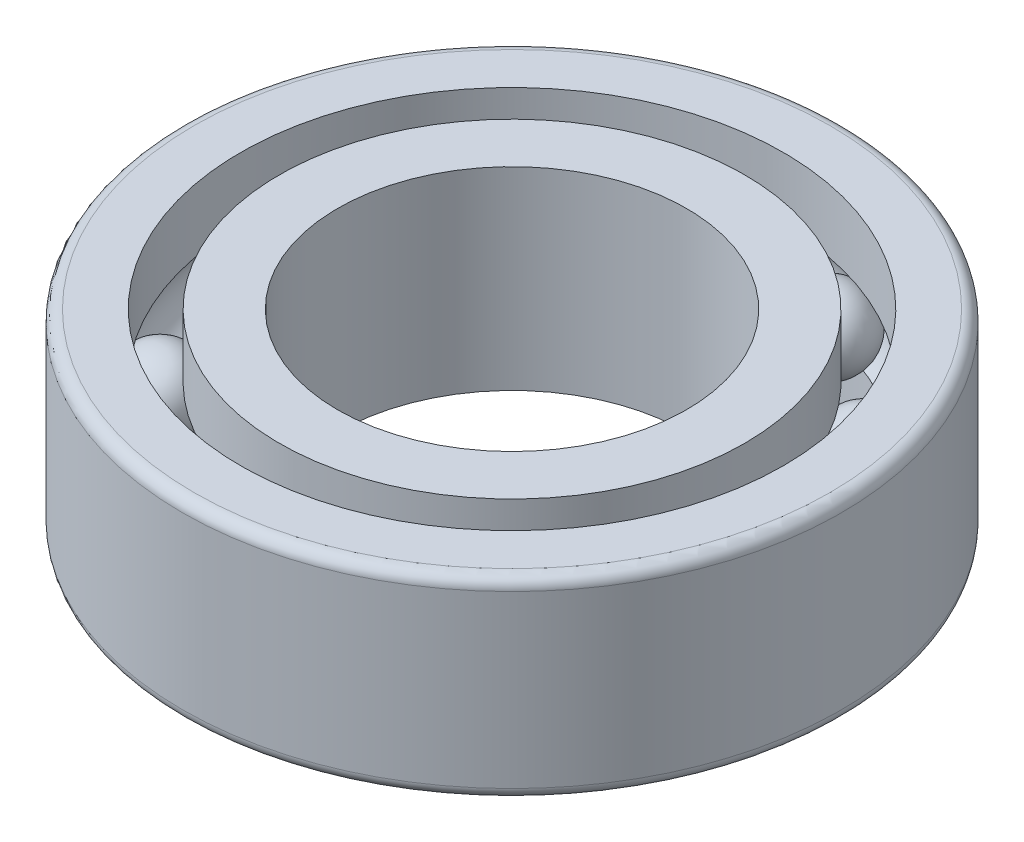
ISO-10303-21;
HEADER;
FILE_DESCRIPTION(('STEP AP214'),'2;1');
FILE_NAME('part.step','',(''),(''),'','','');
FILE_SCHEMA(('AUTOMOTIVE_DESIGN { 1 0 10303 214 1 1 1 1 }'));
ENDSEC;
DATA;
#1=APPLICATION_CONTEXT('core data for automotive mechanical design processes');
#2=APPLICATION_PROTOCOL_DEFINITION('international standard','automotive_design',2000,#1);
#3=PRODUCT_CONTEXT('',#1,'mechanical');
#4=PRODUCT('Part','Part','',(#3));
#5=PRODUCT_RELATED_PRODUCT_CATEGORY('part','',(#4));
#6=PRODUCT_DEFINITION_FORMATION('','',#4);
#7=PRODUCT_DEFINITION_CONTEXT('part definition',#1,'design');
#8=PRODUCT_DEFINITION('design','',#6,#7);
#9=PRODUCT_DEFINITION_SHAPE('','',#8);
#10=(LENGTH_UNIT() NAMED_UNIT(*) SI_UNIT(.MILLI.,.METRE.));
#11=(NAMED_UNIT(*) PLANE_ANGLE_UNIT() SI_UNIT($,.RADIAN.));
#12=(NAMED_UNIT(*) SI_UNIT($,.STERADIAN.) SOLID_ANGLE_UNIT());
#13=UNCERTAINTY_MEASURE_WITH_UNIT(LENGTH_MEASURE(1.E-05),#10,'distance_accuracy_value','');
#14=(GEOMETRIC_REPRESENTATION_CONTEXT(3) GLOBAL_UNCERTAINTY_ASSIGNED_CONTEXT((#13)) GLOBAL_UNIT_ASSIGNED_CONTEXT((#10,
#11,#12)) REPRESENTATION_CONTEXT('',''));
#15=CARTESIAN_POINT('',(0.,0.,0.));
#16=DIRECTION('',(0.,0.,1.));
#17=DIRECTION('',(1.,0.,0.));
#18=AXIS2_PLACEMENT_3D('',#15,#16,#17);
#19=CARTESIAN_POINT('',(-5.25861046343721,0.,3.82060413990101));
#20=DIRECTION('',(0.,-1.,0.));
#21=DIRECTION('',(-0.809016994374955,0.,0.587785252292462));
#22=AXIS2_PLACEMENT_3D('',#19,#20,#21);
#23=SPHERICAL_SURFACE('',#22,1.00000000000002);
#24=CARTESIAN_POINT('',(-5.25861046343721,-1.00000000000005,3.82060413990101));
#25=VERTEX_POINT('',#24);
#26=VERTEX_LOOP('',#25);
#27=FACE_BOUND('',#26,.T.);
#28=ADVANCED_FACE('F37',(#27),#23,.T.);
#29=CLOSED_SHELL('',(#28));
#30=MANIFOLD_SOLID_BREP('B2',#29);
#31=CARTESIAN_POINT('',(-2.00861046343723,0.,6.18186735591848));
#32=DIRECTION('',(0.,-1.,0.));
#33=DIRECTION('',(-0.309016994374958,0.,0.95105651629515));
#34=AXIS2_PLACEMENT_3D('',#31,#32,#33);
#35=SPHERICAL_SURFACE('',#34,1.00000000000002);
#36=CARTESIAN_POINT('',(-2.00861046343723,-1.00000000000005,6.18186735591848));
#37=VERTEX_POINT('',#36);
#38=VERTEX_LOOP('',#37);
#39=FACE_BOUND('',#38,.T.);
#40=ADVANCED_FACE('F68',(#39),#35,.T.);
#41=CLOSED_SHELL('',(#40));
#42=MANIFOLD_SOLID_BREP('B6',#41);
#43=CARTESIAN_POINT('',(2.0086104634371,0.,6.18186735591852));
#44=DIRECTION('',(0.,-1.,0.));
#45=DIRECTION('',(0.309016994374938,0.,0.951056516295157));
#46=AXIS2_PLACEMENT_3D('',#43,#44,#45);
#47=SPHERICAL_SURFACE('',#46,1.00000000000002);
#48=CARTESIAN_POINT('',(2.0086104634371,-1.00000000000005,6.18186735591852));
#49=VERTEX_POINT('',#48);
#50=VERTEX_LOOP('',#49);
#51=FACE_BOUND('',#50,.T.);
#52=ADVANCED_FACE('F99',(#51),#47,.T.);
#53=CLOSED_SHELL('',(#52));
#54=MANIFOLD_SOLID_BREP('B33',#53);
#55=CARTESIAN_POINT('',(5.25861046343713,0.,3.82060413990112));
#56=DIRECTION('',(0.,-1.,0.));
#57=DIRECTION('',(0.809016994374942,0.,0.58778525229248));
#58=AXIS2_PLACEMENT_3D('',#55,#56,#57);
#59=SPHERICAL_SURFACE('',#58,1.00000000000002);
#60=CARTESIAN_POINT('',(5.25861046343713,-1.00000000000005,3.82060413990112));
#61=VERTEX_POINT('',#60);
#62=VERTEX_LOOP('',#61);
#63=FACE_BOUND('',#62,.T.);
#64=ADVANCED_FACE('F130',(#63),#59,.T.);
#65=CLOSED_SHELL('',(#64));
#66=MANIFOLD_SOLID_BREP('B64',#65);
#67=CARTESIAN_POINT('',(6.5,0.,0.));
#68=DIRECTION('',(0.,-1.,0.));
#69=DIRECTION('',(1.,0.,0.));
#70=AXIS2_PLACEMENT_3D('',#67,#68,#69);
#71=SPHERICAL_SURFACE('',#70,1.00000000000002);
#72=CARTESIAN_POINT('',(6.5,-1.00000000000005,0.));
#73=VERTEX_POINT('',#72);
#74=VERTEX_LOOP('',#73);
#75=FACE_BOUND('',#74,.T.);
#76=ADVANCED_FACE('F161',(#75),#71,.T.);
#77=CLOSED_SHELL('',(#76));
#78=MANIFOLD_SOLID_BREP('B95',#77);
#79=CARTESIAN_POINT('',(5.25861046343718,0.,-3.82060413990105));
#80=DIRECTION('',(0.,-1.,0.));
#81=DIRECTION('',(0.809016994374951,0.,-0.587785252292469));
#82=AXIS2_PLACEMENT_3D('',#79,#80,#81);
#83=SPHERICAL_SURFACE('',#82,1.00000000000002);
#84=CARTESIAN_POINT('',(5.25861046343718,-1.00000000000005,-3.82060413990105));
#85=VERTEX_POINT('',#84);
#86=VERTEX_LOOP('',#85);
#87=FACE_BOUND('',#86,.T.);
#88=ADVANCED_FACE('F192',(#87),#83,.T.);
#89=CLOSED_SHELL('',(#88));
#90=MANIFOLD_SOLID_BREP('B126',#89);
#91=CARTESIAN_POINT('',(2.00861046343719,0.,-6.18186735591849));
#92=DIRECTION('',(0.,-1.,0.));
#93=DIRECTION('',(0.309016994374952,0.,-0.951056516295152));
#94=AXIS2_PLACEMENT_3D('',#91,#92,#93);
#95=SPHERICAL_SURFACE('',#94,1.00000000000002);
#96=CARTESIAN_POINT('',(2.00861046343719,-1.00000000000005,-6.18186735591849));
#97=VERTEX_POINT('',#96);
#98=VERTEX_LOOP('',#97);
#99=FACE_BOUND('',#98,.T.);
#100=ADVANCED_FACE('F223',(#99),#95,.T.);
#101=CLOSED_SHELL('',(#100));
#102=MANIFOLD_SOLID_BREP('B157',#101);
#103=CARTESIAN_POINT('',(-2.00861046343714,0.,-6.18186735591851));
#104=DIRECTION('',(0.,-1.,0.));
#105=DIRECTION('',(-0.309016994374945,0.,-0.951056516295155));
#106=AXIS2_PLACEMENT_3D('',#103,#104,#105);
#107=SPHERICAL_SURFACE('',#106,1.00000000000002);
#108=CARTESIAN_POINT('',(-2.00861046343714,-1.00000000000005,-6.18186735591851));
#109=VERTEX_POINT('',#108);
#110=VERTEX_LOOP('',#109);
#111=FACE_BOUND('',#110,.T.);
#112=ADVANCED_FACE('F254',(#111),#107,.T.);
#113=CLOSED_SHELL('',(#112));
#114=MANIFOLD_SOLID_BREP('B188',#113);
#115=CARTESIAN_POINT('',(-5.25861046343715,0.,-3.82060413990108));
#116=DIRECTION('',(0.,-1.,0.));
#117=DIRECTION('',(-0.809016994374947,0.,-0.587785252292474));
#118=AXIS2_PLACEMENT_3D('',#115,#116,#117);
#119=SPHERICAL_SURFACE('',#118,1.00000000000002);
#120=CARTESIAN_POINT('',(-5.25861046343715,-1.00000000000005,-3.82060413990108));
#121=VERTEX_POINT('',#120);
#122=VERTEX_LOOP('',#121);
#123=FACE_BOUND('',#122,.T.);
#124=ADVANCED_FACE('F285',(#123),#119,.T.);
#125=CLOSED_SHELL('',(#124));
#126=MANIFOLD_SOLID_BREP('B219',#125);
#127=CARTESIAN_POINT('',(-6.5,0.,0.));
#128=DIRECTION('',(0.,-1.,0.));
#129=DIRECTION('',(-1.,0.,0.));
#130=AXIS2_PLACEMENT_3D('',#127,#128,#129);
#131=SPHERICAL_SURFACE('',#130,1.00000000000002);
#132=CARTESIAN_POINT('',(-6.5,-1.00000000000005,0.));
#133=VERTEX_POINT('',#132);
#134=VERTEX_LOOP('',#133);
#135=FACE_BOUND('',#134,.T.);
#136=ADVANCED_FACE('F318',(#135),#131,.T.);
#137=CLOSED_SHELL('',(#136));
#138=MANIFOLD_SOLID_BREP('B250',#137);
#139=CARTESIAN_POINT('',(0.,2.5,0.));
#140=DIRECTION('',(0.,1.,0.));
#141=DIRECTION('',(0.,0.,1.));
#142=AXIS2_PLACEMENT_3D('',#139,#140,#141);
#143=PLANE('',#142);
#144=CARTESIAN_POINT('',(0.,2.49999999999995,0.));
#145=DIRECTION('',(0.,-1.,0.));
#146=DIRECTION('',(1.,0.,0.));
#147=AXIS2_PLACEMENT_3D('',#144,#145,#146);
#148=CIRCLE('',#147,6.99999999999999);
#149=CARTESIAN_POINT('',(6.99999999999998,2.49999999999997,0.));
#150=VERTEX_POINT('',#149);
#151=EDGE_CURVE('E343',#150,#150,#148,.T.);
#152=ORIENTED_EDGE('',*,*,#151,.T.);
#153=EDGE_LOOP('',(#152));
#154=FACE_BOUND('',#153,.T.);
#155=CARTESIAN_POINT('',(0.,2.5,0.));
#156=DIRECTION('',(0.,1.,0.));
#157=DIRECTION('',(0.,0.,1.));
#158=AXIS2_PLACEMENT_3D('',#155,#156,#157);
#159=CIRCLE('',#158,8.2);
#160=CARTESIAN_POINT('',(0.,2.5,8.2));
#161=VERTEX_POINT('',#160);
#162=EDGE_CURVE('E365',#161,#161,#159,.T.);
#163=ORIENTED_EDGE('',*,*,#162,.T.);
#164=EDGE_LOOP('',(#163));
#165=FACE_BOUND('',#164,.T.);
#166=ADVANCED_FACE('F339',(#154,#165),#143,.T.);
#167=CARTESIAN_POINT('',(0.,-2.5,0.));
#168=DIRECTION('',(0.,1.,0.));
#169=DIRECTION('',(0.,0.,1.));
#170=AXIS2_PLACEMENT_3D('',#167,#168,#169);
#171=PLANE('',#170);
#172=CARTESIAN_POINT('',(0.,-2.49999999999995,0.));
#173=DIRECTION('',(0.,-1.,0.));
#174=DIRECTION('',(1.,0.,0.));
#175=AXIS2_PLACEMENT_3D('',#172,#173,#174);
#176=CIRCLE('',#175,7.00000000000001);
#177=CARTESIAN_POINT('',(7.00000000000002,-2.49999999999992,0.));
#178=VERTEX_POINT('',#177);
#179=EDGE_CURVE('E317',#178,#178,#176,.T.);
#180=ORIENTED_EDGE('',*,*,#179,.F.);
#181=EDGE_LOOP('',(#180));
#182=FACE_BOUND('',#181,.T.);
#183=CARTESIAN_POINT('',(0.,-2.5,0.));
#184=DIRECTION('',(0.,1.,0.));
#185=DIRECTION('',(0.,0.,1.));
#186=AXIS2_PLACEMENT_3D('',#183,#184,#185);
#187=CIRCLE('',#186,8.2);
#188=CARTESIAN_POINT('',(0.,-2.5,8.2));
#189=VERTEX_POINT('',#188);
#190=EDGE_CURVE('E362',#189,#189,#187,.F.);
#191=ORIENTED_EDGE('',*,*,#190,.T.);
#192=EDGE_LOOP('',(#191));
#193=FACE_BOUND('',#192,.T.);
#194=ADVANCED_FACE('F388',(#182,#193),#171,.F.);
#195=CARTESIAN_POINT('',(0.,2.5,0.));
#196=DIRECTION('',(0.,-1.,0.));
#197=DIRECTION('',(0.,0.,-1.));
#198=AXIS2_PLACEMENT_3D('',#195,#196,#197);
#199=CYLINDRICAL_SURFACE('',#198,8.5);
#200=CARTESIAN_POINT('',(0.,-2.2,0.));
#201=DIRECTION('',(0.,1.,0.));
#202=DIRECTION('',(0.,0.,1.));
#203=AXIS2_PLACEMENT_3D('',#200,#201,#202);
#204=CIRCLE('',#203,8.5);
#205=CARTESIAN_POINT('',(0.,-2.2,8.5));
#206=VERTEX_POINT('',#205);
#207=EDGE_CURVE('E359',#206,#206,#204,.T.);
#208=ORIENTED_EDGE('',*,*,#207,.T.);
#209=EDGE_LOOP('',(#208));
#210=FACE_BOUND('',#209,.T.);
#211=CARTESIAN_POINT('',(0.,2.2,0.));
#212=DIRECTION('',(0.,1.,0.));
#213=DIRECTION('',(0.,0.,1.));
#214=AXIS2_PLACEMENT_3D('',#211,#212,#213);
#215=CIRCLE('',#214,8.5);
#216=CARTESIAN_POINT('',(0.,2.2,8.5));
#217=VERTEX_POINT('',#216);
#218=EDGE_CURVE('E356',#217,#217,#215,.F.);
#219=ORIENTED_EDGE('',*,*,#218,.T.);
#220=EDGE_LOOP('',(#219));
#221=FACE_BOUND('',#220,.T.);
#222=ADVANCED_FACE('F393',(#210,#221),#199,.T.);
#223=CARTESIAN_POINT('',(0.,-2.2,0.));
#224=DIRECTION('',(0.,1.,0.));
#225=DIRECTION('',(0.,0.,1.));
#226=AXIS2_PLACEMENT_3D('',#223,#224,#225);
#227=TOROIDAL_SURFACE('',#226,8.2,0.3);
#228=ORIENTED_EDGE('',*,*,#190,.F.);
#229=EDGE_LOOP('',(#228));
#230=FACE_BOUND('',#229,.T.);
#231=ORIENTED_EDGE('',*,*,#207,.F.);
#232=EDGE_LOOP('',(#231));
#233=FACE_BOUND('',#232,.T.);
#234=ADVANCED_FACE('F398',(#230,#233),#227,.T.);
#235=CARTESIAN_POINT('',(0.,2.2,0.));
#236=DIRECTION('',(0.,1.,0.));
#237=DIRECTION('',(0.,0.,1.));
#238=AXIS2_PLACEMENT_3D('',#235,#236,#237);
#239=TOROIDAL_SURFACE('',#238,8.2,0.3);
#240=ORIENTED_EDGE('',*,*,#218,.F.);
#241=EDGE_LOOP('',(#240));
#242=FACE_BOUND('',#241,.T.);
#243=ORIENTED_EDGE('',*,*,#162,.F.);
#244=EDGE_LOOP('',(#243));
#245=FACE_BOUND('',#244,.T.);
#246=ADVANCED_FACE('F376',(#242,#245),#239,.T.);
#247=CARTESIAN_POINT('',(3.49148133884313E-12,-1000.,0.));
#248=DIRECTION('',(0.,-1.,0.));
#249=DIRECTION('',(1.,0.,0.));
#250=AXIS2_PLACEMENT_3D('',#247,#248,#249);
#251=CYLINDRICAL_SURFACE('',#250,6.99999999999999);
#252=ORIENTED_EDGE('',*,*,#151,.F.);
#253=EDGE_LOOP('',(#252));
#254=FACE_BOUND('',#253,.T.);
#255=CARTESIAN_POINT('',(0.,0.866025403784443,0.));
#256=DIRECTION('',(0.,-1.,0.));
#257=DIRECTION('',(1.,0.,0.));
#258=AXIS2_PLACEMENT_3D('',#255,#256,#257);
#259=CIRCLE('',#258,6.99999999999999);
#260=CARTESIAN_POINT('',(6.99999999999999,0.866025403784467,0.));
#261=VERTEX_POINT('',#260);
#262=EDGE_CURVE('E351',#261,#261,#259,.T.);
#263=ORIENTED_EDGE('',*,*,#262,.T.);
#264=EDGE_LOOP('',(#263));
#265=FACE_BOUND('',#264,.T.);
#266=ADVANCED_FACE('F373',(#254,#265),#251,.F.);
#267=CARTESIAN_POINT('',(0.,0.,0.));
#268=DIRECTION('',(0.,-1.,0.));
#269=DIRECTION('',(1.,0.,0.));
#270=AXIS2_PLACEMENT_3D('',#267,#268,#269);
#271=TOROIDAL_SURFACE('',#270,6.5,1.);
#272=CARTESIAN_POINT('',(0.,-0.866025403784443,0.));
#273=DIRECTION('',(0.,-1.,0.));
#274=DIRECTION('',(1.,0.,0.));
#275=AXIS2_PLACEMENT_3D('',#272,#273,#274);
#276=CIRCLE('',#275,7.);
#277=CARTESIAN_POINT('',(7.,-0.866025403784418,0.));
#278=VERTEX_POINT('',#277);
#279=EDGE_CURVE('E347',#278,#278,#276,.T.);
#280=ORIENTED_EDGE('',*,*,#279,.T.);
#281=EDGE_LOOP('',(#280));
#282=FACE_BOUND('',#281,.T.);
#283=ORIENTED_EDGE('',*,*,#262,.F.);
#284=EDGE_LOOP('',(#283));
#285=FACE_BOUND('',#284,.T.);
#286=ADVANCED_FACE('F341',(#282,#285),#271,.F.);
#287=CARTESIAN_POINT('',(3.49148133884313E-12,-1000.,0.));
#288=DIRECTION('',(0.,-1.,0.));
#289=DIRECTION('',(1.,0.,0.));
#290=AXIS2_PLACEMENT_3D('',#287,#288,#289);
#291=CYLINDRICAL_SURFACE('',#290,7.);
#292=ORIENTED_EDGE('',*,*,#179,.T.);
#293=EDGE_LOOP('',(#292));
#294=FACE_BOUND('',#293,.T.);
#295=ORIENTED_EDGE('',*,*,#279,.F.);
#296=EDGE_LOOP('',(#295));
#297=FACE_BOUND('',#296,.T.);
#298=ADVANCED_FACE('F381',(#294,#297),#291,.F.);
#299=CLOSED_SHELL('',(#166,#194,#222,#234,#246,#266,#286,#298));
#300=MANIFOLD_SOLID_BREP('B281',#299);
#301=CARTESIAN_POINT('',(0.,2.5,0.));
#302=DIRECTION('',(0.,1.,0.));
#303=DIRECTION('',(0.,0.,1.));
#304=AXIS2_PLACEMENT_3D('',#301,#302,#303);
#305=PLANE('',#304);
#306=CARTESIAN_POINT('',(0.,2.5,0.));
#307=DIRECTION('',(0.,1.,0.));
#308=DIRECTION('',(0.,0.,1.));
#309=AXIS2_PLACEMENT_3D('',#306,#307,#308);
#310=CIRCLE('',#309,4.5);
#311=CARTESIAN_POINT('',(0.,2.5,4.5));
#312=VERTEX_POINT('',#311);
#313=EDGE_CURVE('E338',#312,#312,#310,.T.);
#314=ORIENTED_EDGE('',*,*,#313,.F.);
#315=EDGE_LOOP('',(#314));
#316=FACE_BOUND('',#315,.T.);
#317=CARTESIAN_POINT('',(0.,2.49999999999995,0.));
#318=DIRECTION('',(0.,-1.,0.));
#319=DIRECTION('',(1.,0.,0.));
#320=AXIS2_PLACEMENT_3D('',#317,#318,#319);
#321=CIRCLE('',#320,5.99999999999999);
#322=CARTESIAN_POINT('',(5.99999999999999,2.49999999999997,0.));
#323=VERTEX_POINT('',#322);
#324=EDGE_CURVE('E481',#323,#323,#321,.T.);
#325=ORIENTED_EDGE('',*,*,#324,.F.);
#326=EDGE_LOOP('',(#325));
#327=FACE_BOUND('',#326,.T.);
#328=ADVANCED_FACE('F460',(#316,#327),#305,.T.);
#329=CARTESIAN_POINT('',(0.,2.5,0.));
#330=DIRECTION('',(0.,-1.,0.));
#331=DIRECTION('',(0.,0.,-1.));
#332=AXIS2_PLACEMENT_3D('',#329,#330,#331);
#333=CYLINDRICAL_SURFACE('',#332,4.5);
#334=ORIENTED_EDGE('',*,*,#313,.T.);
#335=EDGE_LOOP('',(#334));
#336=FACE_BOUND('',#335,.T.);
#337=CARTESIAN_POINT('',(0.,-2.5,0.));
#338=DIRECTION('',(0.,1.,0.));
#339=DIRECTION('',(0.,0.,1.));
#340=AXIS2_PLACEMENT_3D('',#337,#338,#339);
#341=CIRCLE('',#340,4.5);
#342=CARTESIAN_POINT('',(0.,-2.5,4.5));
#343=VERTEX_POINT('',#342);
#344=EDGE_CURVE('E464',#343,#343,#341,.T.);
#345=ORIENTED_EDGE('',*,*,#344,.F.);
#346=EDGE_LOOP('',(#345));
#347=FACE_BOUND('',#346,.T.);
#348=ADVANCED_FACE('F489',(#336,#347),#333,.F.);
#349=CARTESIAN_POINT('',(0.,-2.5,0.));
#350=DIRECTION('',(0.,1.,0.));
#351=DIRECTION('',(0.,0.,1.));
#352=AXIS2_PLACEMENT_3D('',#349,#350,#351);
#353=PLANE('',#352);
#354=ORIENTED_EDGE('',*,*,#344,.T.);
#355=EDGE_LOOP('',(#354));
#356=FACE_BOUND('',#355,.T.);
#357=CARTESIAN_POINT('',(0.,-2.49999999999995,0.));
#358=DIRECTION('',(0.,-1.,0.));
#359=DIRECTION('',(1.,0.,0.));
#360=AXIS2_PLACEMENT_3D('',#357,#358,#359);
#361=CIRCLE('',#360,6.00000000000001);
#362=CARTESIAN_POINT('',(6.00000000000002,-2.49999999999993,0.));
#363=VERTEX_POINT('',#362);
#364=EDGE_CURVE('E471',#363,#363,#361,.T.);
#365=ORIENTED_EDGE('',*,*,#364,.T.);
#366=EDGE_LOOP('',(#365));
#367=FACE_BOUND('',#366,.T.);
#368=ADVANCED_FACE('F462',(#356,#367),#353,.F.);
#369=CARTESIAN_POINT('',(3.49148133884313E-12,-1000.,0.));
#370=DIRECTION('',(0.,-1.,0.));
#371=DIRECTION('',(1.,0.,0.));
#372=AXIS2_PLACEMENT_3D('',#369,#370,#371);
#373=CYLINDRICAL_SURFACE('',#372,6.);
#374=ORIENTED_EDGE('',*,*,#324,.T.);
#375=EDGE_LOOP('',(#374));
#376=FACE_BOUND('',#375,.T.);
#377=CARTESIAN_POINT('',(0.,0.866025403784443,0.));
#378=DIRECTION('',(0.,-1.,0.));
#379=DIRECTION('',(1.,0.,0.));
#380=AXIS2_PLACEMENT_3D('',#377,#378,#379);
#381=CIRCLE('',#380,6.);
#382=CARTESIAN_POINT('',(6.,0.866025403784464,0.));
#383=VERTEX_POINT('',#382);
#384=EDGE_CURVE('E478',#383,#383,#381,.T.);
#385=ORIENTED_EDGE('',*,*,#384,.F.);
#386=EDGE_LOOP('',(#385));
#387=FACE_BOUND('',#386,.T.);
#388=ADVANCED_FACE('F485',(#376,#387),#373,.T.);
#389=CARTESIAN_POINT('',(0.,0.,0.));
#390=DIRECTION('',(0.,-1.,0.));
#391=DIRECTION('',(1.,0.,0.));
#392=AXIS2_PLACEMENT_3D('',#389,#390,#391);
#393=TOROIDAL_SURFACE('',#392,6.5,1.);
#394=ORIENTED_EDGE('',*,*,#384,.T.);
#395=EDGE_LOOP('',(#394));
#396=FACE_BOUND('',#395,.T.);
#397=CARTESIAN_POINT('',(0.,-0.866025403784443,0.));
#398=DIRECTION('',(0.,-1.,0.));
#399=DIRECTION('',(1.,0.,0.));
#400=AXIS2_PLACEMENT_3D('',#397,#398,#399);
#401=CIRCLE('',#400,6.00000000000001);
#402=CARTESIAN_POINT('',(6.00000000000001,-0.866025403784422,0.));
#403=VERTEX_POINT('',#402);
#404=EDGE_CURVE('E475',#403,#403,#401,.T.);
#405=ORIENTED_EDGE('',*,*,#404,.F.);
#406=EDGE_LOOP('',(#405));
#407=FACE_BOUND('',#406,.T.);
#408=ADVANCED_FACE('F499',(#396,#407),#393,.F.);
#409=CARTESIAN_POINT('',(3.49148133884313E-12,-1000.,0.));
#410=DIRECTION('',(0.,-1.,0.));
#411=DIRECTION('',(1.,0.,0.));
#412=AXIS2_PLACEMENT_3D('',#409,#410,#411);
#413=CYLINDRICAL_SURFACE('',#412,6.00000000000001);
#414=ORIENTED_EDGE('',*,*,#364,.F.);
#415=EDGE_LOOP('',(#414));
#416=FACE_BOUND('',#415,.T.);
#417=ORIENTED_EDGE('',*,*,#404,.T.);
#418=EDGE_LOOP('',(#417));
#419=FACE_BOUND('',#418,.T.);
#420=ADVANCED_FACE('F496',(#416,#419),#413,.T.);
#421=CLOSED_SHELL('',(#328,#348,#368,#388,#408,#420));
#422=MANIFOLD_SOLID_BREP('B312',#421);
#423=ADVANCED_BREP_SHAPE_REPRESENTATION('',(#18,#30,#42,#54,#66,#78,#90,#102,#114,#126,#138,
#300,#422),#14);
#424=SHAPE_DEFINITION_REPRESENTATION(#9,#423);
ENDSEC;
END-ISO-10303-21;
